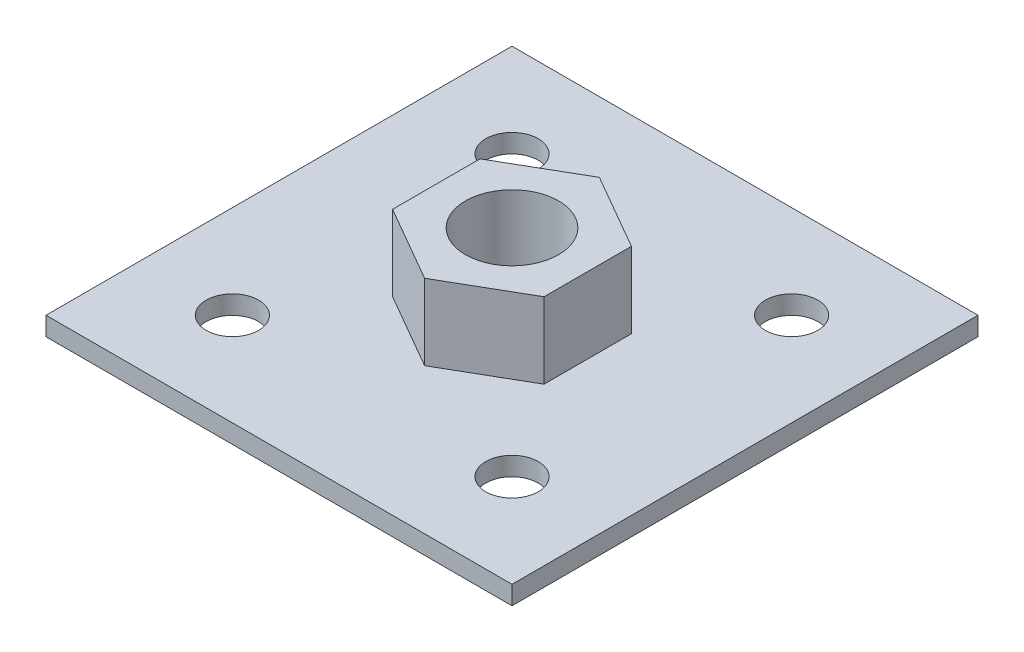
ISO-10303-21;
HEADER;
FILE_DESCRIPTION(('STEP AP214'),'2;1');
FILE_NAME('part.step','',(''),(''),'','','');
FILE_SCHEMA(('AUTOMOTIVE_DESIGN { 1 0 10303 214 1 1 1 1 }'));
ENDSEC;
DATA;
#1=APPLICATION_CONTEXT('core data for automotive mechanical design processes');
#2=APPLICATION_PROTOCOL_DEFINITION('international standard','automotive_design',2000,#1);
#3=PRODUCT_CONTEXT('',#1,'mechanical');
#4=PRODUCT('Part','Part','',(#3));
#5=PRODUCT_RELATED_PRODUCT_CATEGORY('part','',(#4));
#6=PRODUCT_DEFINITION_FORMATION('','',#4);
#7=PRODUCT_DEFINITION_CONTEXT('part definition',#1,'design');
#8=PRODUCT_DEFINITION('design','',#6,#7);
#9=PRODUCT_DEFINITION_SHAPE('','',#8);
#10=(LENGTH_UNIT() NAMED_UNIT(*) SI_UNIT(.MILLI.,.METRE.));
#11=(NAMED_UNIT(*) PLANE_ANGLE_UNIT() SI_UNIT($,.RADIAN.));
#12=(NAMED_UNIT(*) SI_UNIT($,.STERADIAN.) SOLID_ANGLE_UNIT());
#13=UNCERTAINTY_MEASURE_WITH_UNIT(LENGTH_MEASURE(1.E-05),#10,'distance_accuracy_value','');
#14=(GEOMETRIC_REPRESENTATION_CONTEXT(3) GLOBAL_UNCERTAINTY_ASSIGNED_CONTEXT((#13)) GLOBAL_UNIT_ASSIGNED_CONTEXT((#10,
#11,#12)) REPRESENTATION_CONTEXT('',''));
#15=CARTESIAN_POINT('',(0.,0.,0.));
#16=DIRECTION('',(0.,0.,1.));
#17=DIRECTION('',(1.,0.,0.));
#18=AXIS2_PLACEMENT_3D('',#15,#16,#17);
#19=CARTESIAN_POINT('',(0.,1.6,0.));
#20=DIRECTION('',(0.,-1.,0.));
#21=DIRECTION('',(0.,0.,-1.));
#22=AXIS2_PLACEMENT_3D('',#19,#20,#21);
#23=PLANE('',#22);
#24=CARTESIAN_POINT('',(12.,1.6,12.));
#25=DIRECTION('',(0.,1.,0.));
#26=DIRECTION('',(0.,0.,1.));
#27=AXIS2_PLACEMENT_3D('',#24,#25,#26);
#28=CIRCLE('',#27,2.25);
#29=CARTESIAN_POINT('',(12.,1.6,14.25));
#30=VERTEX_POINT('',#29);
#31=EDGE_CURVE('E134',#30,#30,#28,.T.);
#32=ORIENTED_EDGE('',*,*,#31,.F.);
#33=EDGE_LOOP('',(#32));
#34=FACE_BOUND('',#33,.T.);
#35=CARTESIAN_POINT('',(-12.,1.6,12.));
#36=DIRECTION('',(0.,1.,0.));
#37=DIRECTION('',(0.,0.,1.));
#38=AXIS2_PLACEMENT_3D('',#35,#36,#37);
#39=CIRCLE('',#38,2.25);
#40=CARTESIAN_POINT('',(-12.,1.6,14.25));
#41=VERTEX_POINT('',#40);
#42=EDGE_CURVE('E143',#41,#41,#39,.T.);
#43=ORIENTED_EDGE('',*,*,#42,.F.);
#44=EDGE_LOOP('',(#43));
#45=FACE_BOUND('',#44,.T.);
#46=CARTESIAN_POINT('',(12.,1.6,-12.));
#47=DIRECTION('',(0.,1.,0.));
#48=DIRECTION('',(0.,0.,1.));
#49=AXIS2_PLACEMENT_3D('',#46,#47,#48);
#50=CIRCLE('',#49,2.25);
#51=CARTESIAN_POINT('',(12.,1.6,-9.74999999999999));
#52=VERTEX_POINT('',#51);
#53=EDGE_CURVE('E149',#52,#52,#50,.T.);
#54=ORIENTED_EDGE('',*,*,#53,.F.);
#55=EDGE_LOOP('',(#54));
#56=FACE_BOUND('',#55,.T.);
#57=CARTESIAN_POINT('',(-12.,1.6,-12.));
#58=DIRECTION('',(0.,1.,0.));
#59=DIRECTION('',(0.,0.,1.));
#60=AXIS2_PLACEMENT_3D('',#57,#58,#59);
#61=CIRCLE('',#60,2.25);
#62=CARTESIAN_POINT('',(-12.,1.6,-9.74999999999999));
#63=VERTEX_POINT('',#62);
#64=EDGE_CURVE('E155',#63,#63,#61,.T.);
#65=ORIENTED_EDGE('',*,*,#64,.F.);
#66=EDGE_LOOP('',(#65));
#67=FACE_BOUND('',#66,.T.);
#68=DIRECTION('',(0.,0.,-1.));
#69=VECTOR('',#68,1.);
#70=CARTESIAN_POINT('',(20.,1.6,20.));
#71=LINE('',#70,#69);
#72=CARTESIAN_POINT('',(20.,1.6,20.));
#73=VERTEX_POINT('',#72);
#74=CARTESIAN_POINT('',(20.,1.6,-20.));
#75=VERTEX_POINT('',#74);
#76=EDGE_CURVE('E161',#73,#75,#71,.T.);
#77=ORIENTED_EDGE('',*,*,#76,.T.);
#78=DIRECTION('',(-1.,0.,0.));
#79=VECTOR('',#78,1.);
#80=CARTESIAN_POINT('',(-20.,1.6,-20.));
#81=LINE('',#80,#79);
#82=CARTESIAN_POINT('',(-20.,1.6,-20.));
#83=VERTEX_POINT('',#82);
#84=EDGE_CURVE('E164',#75,#83,#81,.T.);
#85=ORIENTED_EDGE('',*,*,#84,.T.);
#86=DIRECTION('',(0.,0.,1.));
#87=VECTOR('',#86,1.);
#88=CARTESIAN_POINT('',(-20.,1.6,20.));
#89=LINE('',#88,#87);
#90=CARTESIAN_POINT('',(-20.,1.6,20.));
#91=VERTEX_POINT('',#90);
#92=EDGE_CURVE('E167',#83,#91,#89,.T.);
#93=ORIENTED_EDGE('',*,*,#92,.T.);
#94=DIRECTION('',(1.,0.,0.));
#95=VECTOR('',#94,1.);
#96=CARTESIAN_POINT('',(-20.,1.6,20.));
#97=LINE('',#96,#95);
#98=EDGE_CURVE('E169',#91,#73,#97,.T.);
#99=ORIENTED_EDGE('',*,*,#98,.T.);
#100=EDGE_LOOP('',(#77,#85,#93,#99));
#101=FACE_BOUND('',#100,.T.);
#102=DIRECTION('',(-0.866281703897573,0.,0.499555812189507));
#103=VECTOR('',#102,1.);
#104=CARTESIAN_POINT('',(-6.5,1.6,-3.75166644450368));
#105=LINE('',#104,#103);
#106=CARTESIAN_POINT('',(0.,1.6,-7.5));
#107=VERTEX_POINT('',#106);
#108=CARTESIAN_POINT('',(-6.5,1.6,-3.75166644450368));
#109=VERTEX_POINT('',#108);
#110=EDGE_CURVE('E49',#107,#109,#105,.T.);
#111=ORIENTED_EDGE('',*,*,#110,.F.);
#112=DIRECTION('',(-0.866281703897573,0.,-0.499555812189507));
#113=VECTOR('',#112,1.);
#114=CARTESIAN_POINT('',(0.,1.6,-7.5));
#115=LINE('',#114,#113);
#116=CARTESIAN_POINT('',(6.5,1.6,-3.75166644450369));
#117=VERTEX_POINT('',#116);
#118=EDGE_CURVE('E53',#117,#107,#115,.T.);
#119=ORIENTED_EDGE('',*,*,#118,.F.);
#120=DIRECTION('',(0.,0.,-1.));
#121=VECTOR('',#120,1.);
#122=CARTESIAN_POINT('',(6.5,1.6,-3.75166644450369));
#123=LINE('',#122,#121);
#124=CARTESIAN_POINT('',(6.5,1.6,3.75166644450368));
#125=VERTEX_POINT('',#124);
#126=EDGE_CURVE('E306',#125,#117,#123,.T.);
#127=ORIENTED_EDGE('',*,*,#126,.F.);
#128=DIRECTION('',(0.866281703897573,0.,-0.499555812189507));
#129=VECTOR('',#128,1.);
#130=CARTESIAN_POINT('',(6.5,1.6,3.75166644450368));
#131=LINE('',#130,#129);
#132=CARTESIAN_POINT('',(0.,1.6,7.5));
#133=VERTEX_POINT('',#132);
#134=EDGE_CURVE('E303',#133,#125,#131,.T.);
#135=ORIENTED_EDGE('',*,*,#134,.F.);
#136=DIRECTION('',(0.866281703897573,0.,0.499555812189507));
#137=VECTOR('',#136,1.);
#138=CARTESIAN_POINT('',(0.,1.6,7.5));
#139=LINE('',#138,#137);
#140=CARTESIAN_POINT('',(-6.5,1.6,3.75166644450368));
#141=VERTEX_POINT('',#140);
#142=EDGE_CURVE('E300',#141,#133,#139,.T.);
#143=ORIENTED_EDGE('',*,*,#142,.F.);
#144=DIRECTION('',(0.,0.,1.));
#145=VECTOR('',#144,1.);
#146=CARTESIAN_POINT('',(-6.5,1.6,3.75166644450368));
#147=LINE('',#146,#145);
#148=EDGE_CURVE('E298',#109,#141,#147,.T.);
#149=ORIENTED_EDGE('',*,*,#148,.F.);
#150=EDGE_LOOP('',(#111,#119,#127,#135,#143,#149));
#151=FACE_BOUND('',#150,.T.);
#152=ADVANCED_FACE('F34',(#34,#45,#56,#67,#101,#151),#23,.F.);
#153=CARTESIAN_POINT('',(0.,0.,0.));
#154=DIRECTION('',(0.,-1.,0.));
#155=DIRECTION('',(0.,0.,-1.));
#156=AXIS2_PLACEMENT_3D('',#153,#154,#155);
#157=PLANE('',#156);
#158=CARTESIAN_POINT('',(0.,0.,0.));
#159=DIRECTION('',(0.,1.,0.));
#160=DIRECTION('',(0.,0.,1.));
#161=AXIS2_PLACEMENT_3D('',#158,#159,#160);
#162=CIRCLE('',#161,4.);
#163=CARTESIAN_POINT('',(0.,0.,4.));
#164=VERTEX_POINT('',#163);
#165=EDGE_CURVE('E283',#164,#164,#162,.T.);
#166=ORIENTED_EDGE('',*,*,#165,.T.);
#167=EDGE_LOOP('',(#166));
#168=FACE_BOUND('',#167,.T.);
#169=CARTESIAN_POINT('',(-12.,0.,12.));
#170=DIRECTION('',(0.,1.,0.));
#171=DIRECTION('',(0.,0.,1.));
#172=AXIS2_PLACEMENT_3D('',#169,#170,#171);
#173=CIRCLE('',#172,2.25);
#174=CARTESIAN_POINT('',(-12.,0.,14.25));
#175=VERTEX_POINT('',#174);
#176=EDGE_CURVE('E141',#175,#175,#173,.T.);
#177=ORIENTED_EDGE('',*,*,#176,.T.);
#178=EDGE_LOOP('',(#177));
#179=FACE_BOUND('',#178,.T.);
#180=CARTESIAN_POINT('',(-12.,0.,-12.));
#181=DIRECTION('',(0.,1.,0.));
#182=DIRECTION('',(0.,0.,1.));
#183=AXIS2_PLACEMENT_3D('',#180,#181,#182);
#184=CIRCLE('',#183,2.25);
#185=CARTESIAN_POINT('',(-12.,0.,-9.74999999999999));
#186=VERTEX_POINT('',#185);
#187=EDGE_CURVE('E152',#186,#186,#184,.T.);
#188=ORIENTED_EDGE('',*,*,#187,.T.);
#189=EDGE_LOOP('',(#188));
#190=FACE_BOUND('',#189,.T.);
#191=DIRECTION('',(0.,0.,-1.));
#192=VECTOR('',#191,1.);
#193=CARTESIAN_POINT('',(20.,0.,20.));
#194=LINE('',#193,#192);
#195=CARTESIAN_POINT('',(20.,0.,20.));
#196=VERTEX_POINT('',#195);
#197=CARTESIAN_POINT('',(20.,0.,-20.));
#198=VERTEX_POINT('',#197);
#199=EDGE_CURVE('E158',#196,#198,#194,.T.);
#200=ORIENTED_EDGE('',*,*,#199,.F.);
#201=DIRECTION('',(1.,0.,0.));
#202=VECTOR('',#201,1.);
#203=CARTESIAN_POINT('',(-20.,0.,20.));
#204=LINE('',#203,#202);
#205=CARTESIAN_POINT('',(-20.,0.,20.));
#206=VERTEX_POINT('',#205);
#207=EDGE_CURVE('E165',#206,#196,#204,.T.);
#208=ORIENTED_EDGE('',*,*,#207,.F.);
#209=DIRECTION('',(0.,0.,1.));
#210=VECTOR('',#209,1.);
#211=CARTESIAN_POINT('',(-20.,0.,20.));
#212=LINE('',#211,#210);
#213=CARTESIAN_POINT('',(-20.,0.,-20.));
#214=VERTEX_POINT('',#213);
#215=EDGE_CURVE('E176',#214,#206,#212,.T.);
#216=ORIENTED_EDGE('',*,*,#215,.F.);
#217=DIRECTION('',(-1.,0.,0.));
#218=VECTOR('',#217,1.);
#219=CARTESIAN_POINT('',(-20.,0.,-20.));
#220=LINE('',#219,#218);
#221=EDGE_CURVE('E174',#198,#214,#220,.T.);
#222=ORIENTED_EDGE('',*,*,#221,.F.);
#223=EDGE_LOOP('',(#200,#208,#216,#222));
#224=FACE_BOUND('',#223,.T.);
#225=CARTESIAN_POINT('',(12.,0.,-12.));
#226=DIRECTION('',(0.,1.,0.));
#227=DIRECTION('',(0.,0.,1.));
#228=AXIS2_PLACEMENT_3D('',#225,#226,#227);
#229=CIRCLE('',#228,2.25);
#230=CARTESIAN_POINT('',(12.,0.,-9.74999999999999));
#231=VERTEX_POINT('',#230);
#232=EDGE_CURVE('E146',#231,#231,#229,.T.);
#233=ORIENTED_EDGE('',*,*,#232,.T.);
#234=EDGE_LOOP('',(#233));
#235=FACE_BOUND('',#234,.T.);
#236=CARTESIAN_POINT('',(12.,0.,12.));
#237=DIRECTION('',(0.,1.,0.));
#238=DIRECTION('',(0.,0.,1.));
#239=AXIS2_PLACEMENT_3D('',#236,#237,#238);
#240=CIRCLE('',#239,2.25);
#241=CARTESIAN_POINT('',(12.,0.,14.25));
#242=VERTEX_POINT('',#241);
#243=EDGE_CURVE('E131',#242,#242,#240,.T.);
#244=ORIENTED_EDGE('',*,*,#243,.T.);
#245=EDGE_LOOP('',(#244));
#246=FACE_BOUND('',#245,.T.);
#247=ADVANCED_FACE('F194',(#168,#179,#190,#224,#235,#246),#157,.T.);
#248=CARTESIAN_POINT('',(20.,1.6,20.));
#249=DIRECTION('',(-1.,0.,0.));
#250=DIRECTION('',(0.,0.,1.));
#251=AXIS2_PLACEMENT_3D('',#248,#249,#250);
#252=PLANE('',#251);
#253=ORIENTED_EDGE('',*,*,#199,.T.);
#254=DIRECTION('',(0.,-1.,0.));
#255=VECTOR('',#254,1.);
#256=CARTESIAN_POINT('',(20.,1.6,-20.));
#257=LINE('',#256,#255);
#258=EDGE_CURVE('E11',#75,#198,#257,.T.);
#259=ORIENTED_EDGE('',*,*,#258,.F.);
#260=ORIENTED_EDGE('',*,*,#76,.F.);
#261=DIRECTION('',(0.,-1.,0.));
#262=VECTOR('',#261,1.);
#263=CARTESIAN_POINT('',(20.,1.6,20.));
#264=LINE('',#263,#262);
#265=EDGE_CURVE('E171',#73,#196,#264,.T.);
#266=ORIENTED_EDGE('',*,*,#265,.T.);
#267=EDGE_LOOP('',(#253,#259,#260,#266));
#268=FACE_BOUND('',#267,.T.);
#269=ADVANCED_FACE('F36',(#268),#252,.F.);
#270=CARTESIAN_POINT('',(-20.,1.6,-20.));
#271=DIRECTION('',(0.,0.,1.));
#272=DIRECTION('',(1.,0.,0.));
#273=AXIS2_PLACEMENT_3D('',#270,#271,#272);
#274=PLANE('',#273);
#275=ORIENTED_EDGE('',*,*,#221,.T.);
#276=DIRECTION('',(0.,-1.,0.));
#277=VECTOR('',#276,1.);
#278=CARTESIAN_POINT('',(-20.,1.6,-20.));
#279=LINE('',#278,#277);
#280=EDGE_CURVE('E42',#83,#214,#279,.T.);
#281=ORIENTED_EDGE('',*,*,#280,.F.);
#282=ORIENTED_EDGE('',*,*,#84,.F.);
#283=ORIENTED_EDGE('',*,*,#258,.T.);
#284=EDGE_LOOP('',(#275,#281,#282,#283));
#285=FACE_BOUND('',#284,.T.);
#286=ADVANCED_FACE('F204',(#285),#274,.F.);
#287=CARTESIAN_POINT('',(-20.,1.6,20.));
#288=DIRECTION('',(1.,0.,0.));
#289=DIRECTION('',(0.,0.,-1.));
#290=AXIS2_PLACEMENT_3D('',#287,#288,#289);
#291=PLANE('',#290);
#292=ORIENTED_EDGE('',*,*,#215,.T.);
#293=DIRECTION('',(0.,-1.,0.));
#294=VECTOR('',#293,1.);
#295=CARTESIAN_POINT('',(-20.,1.6,20.));
#296=LINE('',#295,#294);
#297=EDGE_CURVE('E181',#91,#206,#296,.T.);
#298=ORIENTED_EDGE('',*,*,#297,.F.);
#299=ORIENTED_EDGE('',*,*,#92,.F.);
#300=ORIENTED_EDGE('',*,*,#280,.T.);
#301=EDGE_LOOP('',(#292,#298,#299,#300));
#302=FACE_BOUND('',#301,.T.);
#303=ADVANCED_FACE('F188',(#302),#291,.F.);
#304=CARTESIAN_POINT('',(-20.,1.6,20.));
#305=DIRECTION('',(0.,0.,-1.));
#306=DIRECTION('',(-1.,0.,0.));
#307=AXIS2_PLACEMENT_3D('',#304,#305,#306);
#308=PLANE('',#307);
#309=ORIENTED_EDGE('',*,*,#207,.T.);
#310=ORIENTED_EDGE('',*,*,#265,.F.);
#311=ORIENTED_EDGE('',*,*,#98,.F.);
#312=ORIENTED_EDGE('',*,*,#297,.T.);
#313=EDGE_LOOP('',(#309,#310,#311,#312));
#314=FACE_BOUND('',#313,.T.);
#315=ADVANCED_FACE('F198',(#314),#308,.F.);
#316=CARTESIAN_POINT('',(-12.,1.6,-12.));
#317=DIRECTION('',(0.,-1.,0.));
#318=DIRECTION('',(0.,0.,-1.));
#319=AXIS2_PLACEMENT_3D('',#316,#317,#318);
#320=CYLINDRICAL_SURFACE('',#319,2.25);
#321=ORIENTED_EDGE('',*,*,#64,.T.);
#322=EDGE_LOOP('',(#321));
#323=FACE_BOUND('',#322,.T.);
#324=ORIENTED_EDGE('',*,*,#187,.F.);
#325=EDGE_LOOP('',(#324));
#326=FACE_BOUND('',#325,.T.);
#327=ADVANCED_FACE('F222',(#323,#326),#320,.F.);
#328=CARTESIAN_POINT('',(12.,1.6,-12.));
#329=DIRECTION('',(0.,-1.,0.));
#330=DIRECTION('',(0.,0.,-1.));
#331=AXIS2_PLACEMENT_3D('',#328,#329,#330);
#332=CYLINDRICAL_SURFACE('',#331,2.25);
#333=ORIENTED_EDGE('',*,*,#53,.T.);
#334=EDGE_LOOP('',(#333));
#335=FACE_BOUND('',#334,.T.);
#336=ORIENTED_EDGE('',*,*,#232,.F.);
#337=EDGE_LOOP('',(#336));
#338=FACE_BOUND('',#337,.T.);
#339=ADVANCED_FACE('F229',(#335,#338),#332,.F.);
#340=CARTESIAN_POINT('',(-12.,1.6,12.));
#341=DIRECTION('',(0.,-1.,0.));
#342=DIRECTION('',(0.,0.,-1.));
#343=AXIS2_PLACEMENT_3D('',#340,#341,#342);
#344=CYLINDRICAL_SURFACE('',#343,2.25);
#345=ORIENTED_EDGE('',*,*,#42,.T.);
#346=EDGE_LOOP('',(#345));
#347=FACE_BOUND('',#346,.T.);
#348=ORIENTED_EDGE('',*,*,#176,.F.);
#349=EDGE_LOOP('',(#348));
#350=FACE_BOUND('',#349,.T.);
#351=ADVANCED_FACE('F234',(#347,#350),#344,.F.);
#352=CARTESIAN_POINT('',(12.,1.6,12.));
#353=DIRECTION('',(0.,-1.,0.));
#354=DIRECTION('',(0.,0.,-1.));
#355=AXIS2_PLACEMENT_3D('',#352,#353,#354);
#356=CYLINDRICAL_SURFACE('',#355,2.25);
#357=ORIENTED_EDGE('',*,*,#31,.T.);
#358=EDGE_LOOP('',(#357));
#359=FACE_BOUND('',#358,.T.);
#360=ORIENTED_EDGE('',*,*,#243,.F.);
#361=EDGE_LOOP('',(#360));
#362=FACE_BOUND('',#361,.T.);
#363=ADVANCED_FACE('F244',(#359,#362),#356,.F.);
#364=CARTESIAN_POINT('',(-6.5,8.1,-3.75166644450368));
#365=DIRECTION('',(0.499555812189507,0.,0.866281703897573));
#366=DIRECTION('',(0.866281703897573,0.,-0.499555812189507));
#367=AXIS2_PLACEMENT_3D('',#364,#365,#366);
#368=PLANE('',#367);
#369=ORIENTED_EDGE('',*,*,#110,.T.);
#370=DIRECTION('',(0.,-1.,0.));
#371=VECTOR('',#370,1.);
#372=CARTESIAN_POINT('',(-6.5,8.1,-3.75166644450368));
#373=LINE('',#372,#371);
#374=CARTESIAN_POINT('',(-6.5,8.1,-3.75166644450368));
#375=VERTEX_POINT('',#374);
#376=EDGE_CURVE('E114',#375,#109,#373,.T.);
#377=ORIENTED_EDGE('',*,*,#376,.F.);
#378=DIRECTION('',(-0.866281703897573,0.,0.499555812189507));
#379=VECTOR('',#378,1.);
#380=CARTESIAN_POINT('',(-6.5,8.1,-3.75166644450368));
#381=LINE('',#380,#379);
#382=CARTESIAN_POINT('',(0.,8.1,-7.5));
#383=VERTEX_POINT('',#382);
#384=EDGE_CURVE('E120',#383,#375,#381,.T.);
#385=ORIENTED_EDGE('',*,*,#384,.F.);
#386=DIRECTION('',(0.,-1.,0.));
#387=VECTOR('',#386,1.);
#388=CARTESIAN_POINT('',(0.,8.1,-7.5));
#389=LINE('',#388,#387);
#390=EDGE_CURVE('E296',#383,#107,#389,.T.);
#391=ORIENTED_EDGE('',*,*,#390,.T.);
#392=EDGE_LOOP('',(#369,#377,#385,#391));
#393=FACE_BOUND('',#392,.T.);
#394=ADVANCED_FACE('F130',(#393),#368,.F.);
#395=CARTESIAN_POINT('',(-6.5,8.1,3.75166644450368));
#396=DIRECTION('',(1.,0.,0.));
#397=DIRECTION('',(0.,0.,-1.));
#398=AXIS2_PLACEMENT_3D('',#395,#396,#397);
#399=PLANE('',#398);
#400=ORIENTED_EDGE('',*,*,#148,.T.);
#401=DIRECTION('',(0.,-1.,0.));
#402=VECTOR('',#401,1.);
#403=CARTESIAN_POINT('',(-6.5,8.1,3.75166644450368));
#404=LINE('',#403,#402);
#405=CARTESIAN_POINT('',(-6.5,8.1,3.75166644450368));
#406=VERTEX_POINT('',#405);
#407=EDGE_CURVE('E116',#406,#141,#404,.T.);
#408=ORIENTED_EDGE('',*,*,#407,.F.);
#409=DIRECTION('',(0.,0.,1.));
#410=VECTOR('',#409,1.);
#411=CARTESIAN_POINT('',(-6.5,8.1,3.75166644450368));
#412=LINE('',#411,#410);
#413=EDGE_CURVE('E109',#375,#406,#412,.T.);
#414=ORIENTED_EDGE('',*,*,#413,.F.);
#415=ORIENTED_EDGE('',*,*,#376,.T.);
#416=EDGE_LOOP('',(#400,#408,#414,#415));
#417=FACE_BOUND('',#416,.T.);
#418=ADVANCED_FACE('F112',(#417),#399,.F.);
#419=CARTESIAN_POINT('',(0.,8.1,7.5));
#420=DIRECTION('',(0.499555812189507,0.,-0.866281703897573));
#421=DIRECTION('',(-0.866281703897573,0.,-0.499555812189507));
#422=AXIS2_PLACEMENT_3D('',#419,#420,#421);
#423=PLANE('',#422);
#424=ORIENTED_EDGE('',*,*,#142,.T.);
#425=DIRECTION('',(0.,-1.,0.));
#426=VECTOR('',#425,1.);
#427=CARTESIAN_POINT('',(0.,8.1,7.5));
#428=LINE('',#427,#426);
#429=CARTESIAN_POINT('',(0.,8.1,7.5));
#430=VERTEX_POINT('',#429);
#431=EDGE_CURVE('E136',#430,#133,#428,.T.);
#432=ORIENTED_EDGE('',*,*,#431,.F.);
#433=DIRECTION('',(0.866281703897573,0.,0.499555812189507));
#434=VECTOR('',#433,1.);
#435=CARTESIAN_POINT('',(0.,8.1,7.5));
#436=LINE('',#435,#434);
#437=EDGE_CURVE('E119',#406,#430,#436,.T.);
#438=ORIENTED_EDGE('',*,*,#437,.F.);
#439=ORIENTED_EDGE('',*,*,#407,.T.);
#440=EDGE_LOOP('',(#424,#432,#438,#439));
#441=FACE_BOUND('',#440,.T.);
#442=ADVANCED_FACE('F256',(#441),#423,.F.);
#443=CARTESIAN_POINT('',(6.5,8.1,3.75166644450368));
#444=DIRECTION('',(-0.499555812189507,0.,-0.866281703897573));
#445=DIRECTION('',(-0.866281703897573,0.,0.499555812189507));
#446=AXIS2_PLACEMENT_3D('',#443,#444,#445);
#447=PLANE('',#446);
#448=ORIENTED_EDGE('',*,*,#134,.T.);
#449=DIRECTION('',(0.,-1.,0.));
#450=VECTOR('',#449,1.);
#451=CARTESIAN_POINT('',(6.5,8.1,3.75166644450368));
#452=LINE('',#451,#450);
#453=CARTESIAN_POINT('',(6.5,8.1,3.75166644450368));
#454=VERTEX_POINT('',#453);
#455=EDGE_CURVE('E313',#454,#125,#452,.T.);
#456=ORIENTED_EDGE('',*,*,#455,.F.);
#457=DIRECTION('',(0.866281703897573,0.,-0.499555812189507));
#458=VECTOR('',#457,1.);
#459=CARTESIAN_POINT('',(6.5,8.1,3.75166644450368));
#460=LINE('',#459,#458);
#461=EDGE_CURVE('E291',#430,#454,#460,.T.);
#462=ORIENTED_EDGE('',*,*,#461,.F.);
#463=ORIENTED_EDGE('',*,*,#431,.T.);
#464=EDGE_LOOP('',(#448,#456,#462,#463));
#465=FACE_BOUND('',#464,.T.);
#466=ADVANCED_FACE('F259',(#465),#447,.F.);
#467=CARTESIAN_POINT('',(6.5,8.1,-3.75166644450369));
#468=DIRECTION('',(-1.,0.,0.));
#469=DIRECTION('',(0.,0.,1.));
#470=AXIS2_PLACEMENT_3D('',#467,#468,#469);
#471=PLANE('',#470);
#472=ORIENTED_EDGE('',*,*,#126,.T.);
#473=DIRECTION('',(0.,-1.,0.));
#474=VECTOR('',#473,1.);
#475=CARTESIAN_POINT('',(6.5,8.1,-3.75166644450369));
#476=LINE('',#475,#474);
#477=CARTESIAN_POINT('',(6.5,8.1,-3.75166644450369));
#478=VERTEX_POINT('',#477);
#479=EDGE_CURVE('E310',#478,#117,#476,.T.);
#480=ORIENTED_EDGE('',*,*,#479,.F.);
#481=DIRECTION('',(0.,0.,-1.));
#482=VECTOR('',#481,1.);
#483=CARTESIAN_POINT('',(6.5,8.1,-3.75166644450369));
#484=LINE('',#483,#482);
#485=EDGE_CURVE('E293',#454,#478,#484,.T.);
#486=ORIENTED_EDGE('',*,*,#485,.F.);
#487=ORIENTED_EDGE('',*,*,#455,.T.);
#488=EDGE_LOOP('',(#472,#480,#486,#487));
#489=FACE_BOUND('',#488,.T.);
#490=ADVANCED_FACE('F263',(#489),#471,.F.);
#491=CARTESIAN_POINT('',(0.,8.1,-7.5));
#492=DIRECTION('',(-0.499555812189507,0.,0.866281703897573));
#493=DIRECTION('',(0.866281703897573,0.,0.499555812189507));
#494=AXIS2_PLACEMENT_3D('',#491,#492,#493);
#495=PLANE('',#494);
#496=ORIENTED_EDGE('',*,*,#118,.T.);
#497=ORIENTED_EDGE('',*,*,#390,.F.);
#498=DIRECTION('',(-0.866281703897573,0.,-0.499555812189507));
#499=VECTOR('',#498,1.);
#500=CARTESIAN_POINT('',(0.,8.1,-7.5));
#501=LINE('',#500,#499);
#502=EDGE_CURVE('E125',#478,#383,#501,.T.);
#503=ORIENTED_EDGE('',*,*,#502,.F.);
#504=ORIENTED_EDGE('',*,*,#479,.T.);
#505=EDGE_LOOP('',(#496,#497,#503,#504));
#506=FACE_BOUND('',#505,.T.);
#507=ADVANCED_FACE('F267',(#506),#495,.F.);
#508=CARTESIAN_POINT('',(0.,8.1,0.));
#509=DIRECTION('',(0.,-1.,0.));
#510=DIRECTION('',(0.,0.,-1.));
#511=AXIS2_PLACEMENT_3D('',#508,#509,#510);
#512=PLANE('',#511);
#513=CARTESIAN_POINT('',(0.,8.1,0.));
#514=DIRECTION('',(0.,1.,0.));
#515=DIRECTION('',(0.,0.,1.));
#516=AXIS2_PLACEMENT_3D('',#513,#514,#515);
#517=CIRCLE('',#516,4.);
#518=CARTESIAN_POINT('',(0.,8.1,4.));
#519=VERTEX_POINT('',#518);
#520=EDGE_CURVE('E286',#519,#519,#517,.T.);
#521=ORIENTED_EDGE('',*,*,#520,.F.);
#522=EDGE_LOOP('',(#521));
#523=FACE_BOUND('',#522,.T.);
#524=ORIENTED_EDGE('',*,*,#384,.T.);
#525=ORIENTED_EDGE('',*,*,#413,.T.);
#526=ORIENTED_EDGE('',*,*,#437,.T.);
#527=ORIENTED_EDGE('',*,*,#461,.T.);
#528=ORIENTED_EDGE('',*,*,#485,.T.);
#529=ORIENTED_EDGE('',*,*,#502,.T.);
#530=EDGE_LOOP('',(#524,#525,#526,#527,#528,#529));
#531=FACE_BOUND('',#530,.T.);
#532=ADVANCED_FACE('F123',(#523,#531),#512,.F.);
#533=CARTESIAN_POINT('',(0.,0.,0.));
#534=DIRECTION('',(0.,1.,0.));
#535=DIRECTION('',(0.,0.,1.));
#536=AXIS2_PLACEMENT_3D('',#533,#534,#535);
#537=CYLINDRICAL_SURFACE('',#536,4.);
#538=ORIENTED_EDGE('',*,*,#165,.F.);
#539=EDGE_LOOP('',(#538));
#540=FACE_BOUND('',#539,.T.);
#541=ORIENTED_EDGE('',*,*,#520,.T.);
#542=EDGE_LOOP('',(#541));
#543=FACE_BOUND('',#542,.T.);
#544=ADVANCED_FACE('F274',(#540,#543),#537,.F.);
#545=CLOSED_SHELL('',(#152,#247,#269,#286,#303,#315,#327,#339,#351,#363,#394,#418,#442,#466,
#490,#507,#532,#544));
#546=MANIFOLD_SOLID_BREP('B2',#545);
#547=ADVANCED_BREP_SHAPE_REPRESENTATION('',(#18,#546),#14);
#548=SHAPE_DEFINITION_REPRESENTATION(#9,#547);
ENDSEC;
END-ISO-10303-21;
